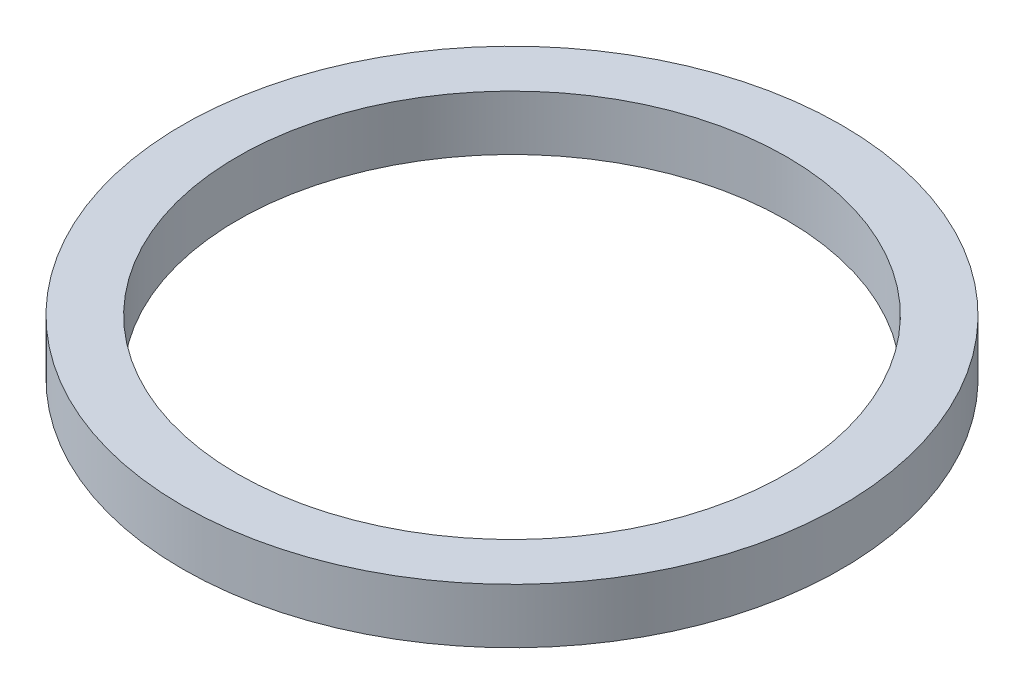
ISO-10303-21;
HEADER;
FILE_DESCRIPTION(('STEP AP214'),'2;1');
FILE_NAME('part.step','',(''),(''),'','','');
FILE_SCHEMA(('AUTOMOTIVE_DESIGN { 1 0 10303 214 1 1 1 1 }'));
ENDSEC;
DATA;
#1=APPLICATION_CONTEXT('core data for automotive mechanical design processes');
#2=APPLICATION_PROTOCOL_DEFINITION('international standard','automotive_design',2000,#1);
#3=PRODUCT_CONTEXT('',#1,'mechanical');
#4=PRODUCT('Part','Part','',(#3));
#5=PRODUCT_RELATED_PRODUCT_CATEGORY('part','',(#4));
#6=PRODUCT_DEFINITION_FORMATION('','',#4);
#7=PRODUCT_DEFINITION_CONTEXT('part definition',#1,'design');
#8=PRODUCT_DEFINITION('design','',#6,#7);
#9=PRODUCT_DEFINITION_SHAPE('','',#8);
#10=(LENGTH_UNIT() NAMED_UNIT(*) SI_UNIT(.MILLI.,.METRE.));
#11=(NAMED_UNIT(*) PLANE_ANGLE_UNIT() SI_UNIT($,.RADIAN.));
#12=(NAMED_UNIT(*) SI_UNIT($,.STERADIAN.) SOLID_ANGLE_UNIT());
#13=UNCERTAINTY_MEASURE_WITH_UNIT(LENGTH_MEASURE(1.E-05),#10,'distance_accuracy_value','');
#14=(GEOMETRIC_REPRESENTATION_CONTEXT(3) GLOBAL_UNCERTAINTY_ASSIGNED_CONTEXT((#13)) GLOBAL_UNIT_ASSIGNED_CONTEXT((#10,
#11,#12)) REPRESENTATION_CONTEXT('',''));
#15=CARTESIAN_POINT('',(0.,0.,0.));
#16=DIRECTION('',(0.,0.,1.));
#17=DIRECTION('',(1.,0.,0.));
#18=AXIS2_PLACEMENT_3D('',#15,#16,#17);
#19=CARTESIAN_POINT('',(0.,1.,0.));
#20=DIRECTION('',(0.,1.,0.));
#21=DIRECTION('',(0.,0.,1.));
#22=AXIS2_PLACEMENT_3D('',#19,#20,#21);
#23=PLANE('',#22);
#24=CARTESIAN_POINT('',(0.,1.,0.));
#25=DIRECTION('',(0.,1.,0.));
#26=DIRECTION('',(0.,0.,1.));
#27=AXIS2_PLACEMENT_3D('',#24,#25,#26);
#28=CIRCLE('',#27,6.);
#29=CARTESIAN_POINT('',(0.,1.,6.));
#30=VERTEX_POINT('',#29);
#31=EDGE_CURVE('E10',#30,#30,#28,.T.);
#32=ORIENTED_EDGE('',*,*,#31,.T.);
#33=EDGE_LOOP('',(#32));
#34=FACE_BOUND('',#33,.T.);
#35=CARTESIAN_POINT('',(0.,1.,0.));
#36=DIRECTION('',(0.,1.,0.));
#37=DIRECTION('',(0.,0.,1.));
#38=AXIS2_PLACEMENT_3D('',#35,#36,#37);
#39=CIRCLE('',#38,5.);
#40=CARTESIAN_POINT('',(0.,1.,5.));
#41=VERTEX_POINT('',#40);
#42=EDGE_CURVE('E50',#41,#41,#39,.T.);
#43=ORIENTED_EDGE('',*,*,#42,.F.);
#44=EDGE_LOOP('',(#43));
#45=FACE_BOUND('',#44,.T.);
#46=ADVANCED_FACE('F37',(#34,#45),#23,.T.);
#47=CARTESIAN_POINT('',(0.,0.,0.));
#48=DIRECTION('',(0.,1.,0.));
#49=DIRECTION('',(0.,0.,1.));
#50=AXIS2_PLACEMENT_3D('',#47,#48,#49);
#51=PLANE('',#50);
#52=CARTESIAN_POINT('',(0.,0.,0.));
#53=DIRECTION('',(0.,1.,0.));
#54=DIRECTION('',(0.,0.,1.));
#55=AXIS2_PLACEMENT_3D('',#52,#53,#54);
#56=CIRCLE('',#55,6.);
#57=CARTESIAN_POINT('',(0.,0.,6.));
#58=VERTEX_POINT('',#57);
#59=EDGE_CURVE('E41',#58,#58,#56,.T.);
#60=ORIENTED_EDGE('',*,*,#59,.F.);
#61=EDGE_LOOP('',(#60));
#62=FACE_BOUND('',#61,.T.);
#63=CARTESIAN_POINT('',(0.,0.,0.));
#64=DIRECTION('',(0.,1.,0.));
#65=DIRECTION('',(0.,0.,1.));
#66=AXIS2_PLACEMENT_3D('',#63,#64,#65);
#67=CIRCLE('',#66,5.);
#68=CARTESIAN_POINT('',(0.,0.,5.));
#69=VERTEX_POINT('',#68);
#70=EDGE_CURVE('E52',#69,#69,#67,.T.);
#71=ORIENTED_EDGE('',*,*,#70,.T.);
#72=EDGE_LOOP('',(#71));
#73=FACE_BOUND('',#72,.T.);
#74=ADVANCED_FACE('F64',(#62,#73),#51,.F.);
#75=CARTESIAN_POINT('',(0.,1.,0.));
#76=DIRECTION('',(0.,-1.,0.));
#77=DIRECTION('',(0.,0.,-1.));
#78=AXIS2_PLACEMENT_3D('',#75,#76,#77);
#79=CYLINDRICAL_SURFACE('',#78,6.);
#80=ORIENTED_EDGE('',*,*,#31,.F.);
#81=EDGE_LOOP('',(#80));
#82=FACE_BOUND('',#81,.T.);
#83=ORIENTED_EDGE('',*,*,#59,.T.);
#84=EDGE_LOOP('',(#83));
#85=FACE_BOUND('',#84,.T.);
#86=ADVANCED_FACE('F39',(#82,#85),#79,.T.);
#87=CARTESIAN_POINT('',(0.,1.,0.));
#88=DIRECTION('',(0.,-1.,0.));
#89=DIRECTION('',(0.,0.,-1.));
#90=AXIS2_PLACEMENT_3D('',#87,#88,#89);
#91=CYLINDRICAL_SURFACE('',#90,5.);
#92=ORIENTED_EDGE('',*,*,#42,.T.);
#93=EDGE_LOOP('',(#92));
#94=FACE_BOUND('',#93,.T.);
#95=ORIENTED_EDGE('',*,*,#70,.F.);
#96=EDGE_LOOP('',(#95));
#97=FACE_BOUND('',#96,.T.);
#98=ADVANCED_FACE('F60',(#94,#97),#91,.F.);
#99=CLOSED_SHELL('',(#46,#74,#86,#98));
#100=MANIFOLD_SOLID_BREP('B2',#99);
#101=ADVANCED_BREP_SHAPE_REPRESENTATION('',(#18,#100),#14);
#102=SHAPE_DEFINITION_REPRESENTATION(#9,#101);
ENDSEC;
END-ISO-10303-21;
